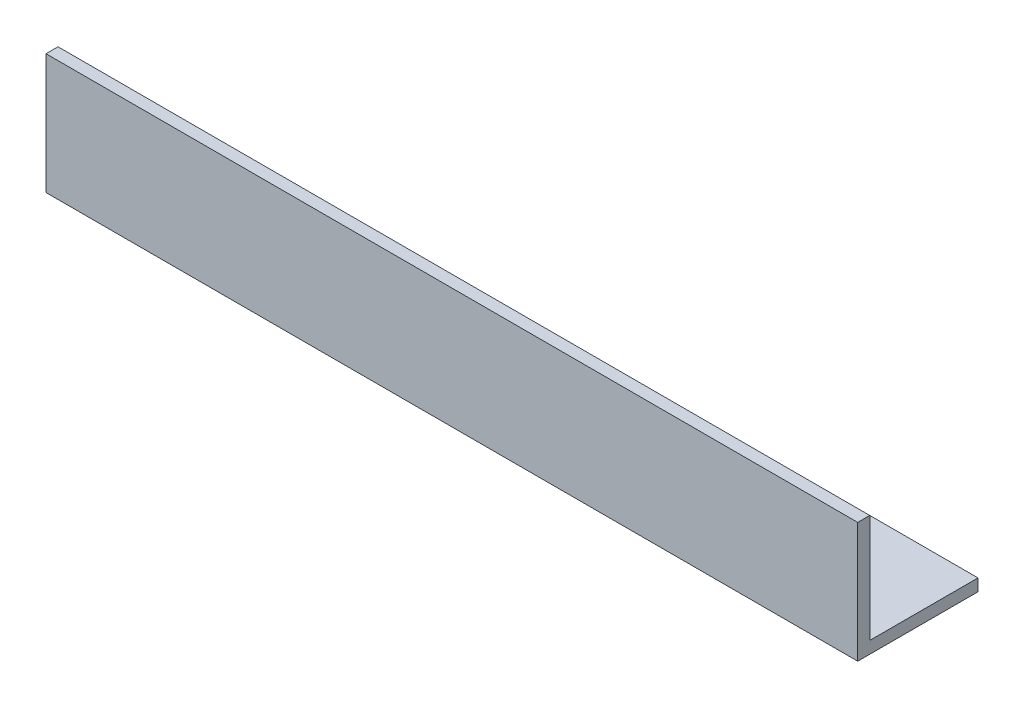
ISO-10303-21;
HEADER;
FILE_DESCRIPTION(('STEP AP214'),'2;1');
FILE_NAME('part.step','',(''),(''),'','','');
FILE_SCHEMA(('AUTOMOTIVE_DESIGN { 1 0 10303 214 1 1 1 1 }'));
ENDSEC;
DATA;
#1=APPLICATION_CONTEXT('core data for automotive mechanical design processes');
#2=APPLICATION_PROTOCOL_DEFINITION('international standard','automotive_design',2000,#1);
#3=PRODUCT_CONTEXT('',#1,'mechanical');
#4=PRODUCT('Part','Part','',(#3));
#5=PRODUCT_RELATED_PRODUCT_CATEGORY('part','',(#4));
#6=PRODUCT_DEFINITION_FORMATION('','',#4);
#7=PRODUCT_DEFINITION_CONTEXT('part definition',#1,'design');
#8=PRODUCT_DEFINITION('design','',#6,#7);
#9=PRODUCT_DEFINITION_SHAPE('','',#8);
#10=(LENGTH_UNIT() NAMED_UNIT(*) SI_UNIT(.MILLI.,.METRE.));
#11=(NAMED_UNIT(*) PLANE_ANGLE_UNIT() SI_UNIT($,.RADIAN.));
#12=(NAMED_UNIT(*) SI_UNIT($,.STERADIAN.) SOLID_ANGLE_UNIT());
#13=UNCERTAINTY_MEASURE_WITH_UNIT(LENGTH_MEASURE(1.E-05),#10,'distance_accuracy_value','');
#14=(GEOMETRIC_REPRESENTATION_CONTEXT(3) GLOBAL_UNCERTAINTY_ASSIGNED_CONTEXT((#13)) GLOBAL_UNIT_ASSIGNED_CONTEXT((#10,
#11,#12)) REPRESENTATION_CONTEXT('',''));
#15=CARTESIAN_POINT('',(0.,0.,0.));
#16=DIRECTION('',(0.,0.,1.));
#17=DIRECTION('',(1.,0.,0.));
#18=AXIS2_PLACEMENT_3D('',#15,#16,#17);
#19=CARTESIAN_POINT('',(135.,20.,-2.));
#20=DIRECTION('',(0.,-1.,0.));
#21=DIRECTION('',(0.,0.,-1.));
#22=AXIS2_PLACEMENT_3D('',#19,#20,#21);
#23=PLANE('',#22);
#24=DIRECTION('',(0.,0.,1.));
#25=VECTOR('',#24,1.);
#26=CARTESIAN_POINT('',(0.,20.,-2.));
#27=LINE('',#26,#25);
#28=CARTESIAN_POINT('',(0.,20.,-2.));
#29=VERTEX_POINT('',#28);
#30=CARTESIAN_POINT('',(0.,20.,0.));
#31=VERTEX_POINT('',#30);
#32=EDGE_CURVE('E127',#29,#31,#27,.T.);
#33=ORIENTED_EDGE('',*,*,#32,.T.);
#34=DIRECTION('',(-1.,0.,0.));
#35=VECTOR('',#34,1.);
#36=CARTESIAN_POINT('',(135.,20.,0.));
#37=LINE('',#36,#35);
#38=CARTESIAN_POINT('',(135.,20.,0.));
#39=VERTEX_POINT('',#38);
#40=EDGE_CURVE('E11',#39,#31,#37,.T.);
#41=ORIENTED_EDGE('',*,*,#40,.F.);
#42=DIRECTION('',(0.,0.,1.));
#43=VECTOR('',#42,1.);
#44=CARTESIAN_POINT('',(135.,20.,-2.));
#45=LINE('',#44,#43);
#46=CARTESIAN_POINT('',(135.,20.,-2.));
#47=VERTEX_POINT('',#46);
#48=EDGE_CURVE('E138',#47,#39,#45,.T.);
#49=ORIENTED_EDGE('',*,*,#48,.F.);
#50=DIRECTION('',(-1.,0.,0.));
#51=VECTOR('',#50,1.);
#52=CARTESIAN_POINT('',(135.,20.,-2.));
#53=LINE('',#52,#51);
#54=EDGE_CURVE('E123',#47,#29,#53,.T.);
#55=ORIENTED_EDGE('',*,*,#54,.T.);
#56=EDGE_LOOP('',(#33,#41,#49,#55));
#57=FACE_BOUND('',#56,.T.);
#58=ADVANCED_FACE('F43',(#57),#23,.F.);
#59=CARTESIAN_POINT('',(135.,20.,0.));
#60=DIRECTION('',(0.,0.,-1.));
#61=DIRECTION('',(0.,1.,0.));
#62=AXIS2_PLACEMENT_3D('',#59,#60,#61);
#63=PLANE('',#62);
#64=DIRECTION('',(0.,-1.,0.));
#65=VECTOR('',#64,1.);
#66=CARTESIAN_POINT('',(0.,20.,0.));
#67=LINE('',#66,#65);
#68=CARTESIAN_POINT('',(0.,0.,0.));
#69=VERTEX_POINT('',#68);
#70=EDGE_CURVE('E130',#31,#69,#67,.T.);
#71=ORIENTED_EDGE('',*,*,#70,.T.);
#72=DIRECTION('',(-1.,0.,0.));
#73=VECTOR('',#72,1.);
#74=CARTESIAN_POINT('',(135.,0.,0.));
#75=LINE('',#74,#73);
#76=CARTESIAN_POINT('',(135.,0.,0.));
#77=VERTEX_POINT('',#76);
#78=EDGE_CURVE('E51',#77,#69,#75,.T.);
#79=ORIENTED_EDGE('',*,*,#78,.F.);
#80=DIRECTION('',(0.,-1.,0.));
#81=VECTOR('',#80,1.);
#82=CARTESIAN_POINT('',(135.,20.,0.));
#83=LINE('',#82,#81);
#84=EDGE_CURVE('E96',#39,#77,#83,.T.);
#85=ORIENTED_EDGE('',*,*,#84,.F.);
#86=ORIENTED_EDGE('',*,*,#40,.T.);
#87=EDGE_LOOP('',(#71,#79,#85,#86));
#88=FACE_BOUND('',#87,.T.);
#89=ADVANCED_FACE('F164',(#88),#63,.F.);
#90=CARTESIAN_POINT('',(135.,0.,0.));
#91=DIRECTION('',(0.,1.,0.));
#92=DIRECTION('',(0.,0.,1.));
#93=AXIS2_PLACEMENT_3D('',#90,#91,#92);
#94=PLANE('',#93);
#95=CARTESIAN_POINT('',(8.,0.,-11.));
#96=DIRECTION('',(0.,1.,0.));
#97=DIRECTION('',(0.,0.,1.));
#98=AXIS2_PLACEMENT_3D('',#95,#96,#97);
#99=CIRCLE('',#98,2.5);
#100=CARTESIAN_POINT('',(8.,0.,-8.5));
#101=VERTEX_POINT('',#100);
#102=EDGE_CURVE('E131',#101,#101,#99,.T.);
#103=ORIENTED_EDGE('',*,*,#102,.T.);
#104=EDGE_LOOP('',(#103));
#105=FACE_BOUND('',#104,.T.);
#106=CARTESIAN_POINT('',(30.,0.,-11.));
#107=DIRECTION('',(0.,1.,0.));
#108=DIRECTION('',(0.,0.,1.));
#109=AXIS2_PLACEMENT_3D('',#106,#107,#108);
#110=CIRCLE('',#109,2.5);
#111=CARTESIAN_POINT('',(30.,0.,-8.5));
#112=VERTEX_POINT('',#111);
#113=EDGE_CURVE('E237',#112,#112,#110,.T.);
#114=ORIENTED_EDGE('',*,*,#113,.T.);
#115=EDGE_LOOP('',(#114));
#116=FACE_BOUND('',#115,.T.);
#117=DIRECTION('',(0.,0.,-1.));
#118=VECTOR('',#117,1.);
#119=CARTESIAN_POINT('',(0.,0.,0.));
#120=LINE('',#119,#118);
#121=CARTESIAN_POINT('',(0.,0.,-20.));
#122=VERTEX_POINT('',#121);
#123=EDGE_CURVE('E133',#69,#122,#120,.T.);
#124=ORIENTED_EDGE('',*,*,#123,.T.);
#125=DIRECTION('',(-1.,0.,0.));
#126=VECTOR('',#125,1.);
#127=CARTESIAN_POINT('',(135.,0.,-20.));
#128=LINE('',#127,#126);
#129=CARTESIAN_POINT('',(135.,0.,-20.));
#130=VERTEX_POINT('',#129);
#131=EDGE_CURVE('E118',#130,#122,#128,.T.);
#132=ORIENTED_EDGE('',*,*,#131,.F.);
#133=DIRECTION('',(0.,0.,-1.));
#134=VECTOR('',#133,1.);
#135=CARTESIAN_POINT('',(135.,0.,0.));
#136=LINE('',#135,#134);
#137=EDGE_CURVE('E109',#77,#130,#136,.T.);
#138=ORIENTED_EDGE('',*,*,#137,.F.);
#139=ORIENTED_EDGE('',*,*,#78,.T.);
#140=EDGE_LOOP('',(#124,#132,#138,#139));
#141=FACE_BOUND('',#140,.T.);
#142=ADVANCED_FACE('F144',(#105,#116,#141),#94,.F.);
#143=CARTESIAN_POINT('',(135.,0.,-20.));
#144=DIRECTION('',(0.,0.,1.));
#145=DIRECTION('',(1.,0.,0.));
#146=AXIS2_PLACEMENT_3D('',#143,#144,#145);
#147=PLANE('',#146);
#148=DIRECTION('',(0.,1.,0.));
#149=VECTOR('',#148,1.);
#150=CARTESIAN_POINT('',(0.,0.,-20.));
#151=LINE('',#150,#149);
#152=CARTESIAN_POINT('',(0.,2.,-20.));
#153=VERTEX_POINT('',#152);
#154=EDGE_CURVE('E117',#122,#153,#151,.T.);
#155=ORIENTED_EDGE('',*,*,#154,.T.);
#156=DIRECTION('',(-1.,0.,0.));
#157=VECTOR('',#156,1.);
#158=CARTESIAN_POINT('',(135.,2.,-20.));
#159=LINE('',#158,#157);
#160=CARTESIAN_POINT('',(135.,2.,-20.));
#161=VERTEX_POINT('',#160);
#162=EDGE_CURVE('E114',#161,#153,#159,.T.);
#163=ORIENTED_EDGE('',*,*,#162,.F.);
#164=DIRECTION('',(0.,1.,0.));
#165=VECTOR('',#164,1.);
#166=CARTESIAN_POINT('',(135.,0.,-20.));
#167=LINE('',#166,#165);
#168=EDGE_CURVE('E103',#130,#161,#167,.T.);
#169=ORIENTED_EDGE('',*,*,#168,.F.);
#170=ORIENTED_EDGE('',*,*,#131,.T.);
#171=EDGE_LOOP('',(#155,#163,#169,#170));
#172=FACE_BOUND('',#171,.T.);
#173=ADVANCED_FACE('F115',(#172),#147,.F.);
#174=CARTESIAN_POINT('',(135.,2.,-20.));
#175=DIRECTION('',(0.,-1.,0.));
#176=DIRECTION('',(0.,0.,-1.));
#177=AXIS2_PLACEMENT_3D('',#174,#175,#176);
#178=PLANE('',#177);
#179=CARTESIAN_POINT('',(8.,2.,-11.));
#180=DIRECTION('',(0.,1.,0.));
#181=DIRECTION('',(0.,0.,1.));
#182=AXIS2_PLACEMENT_3D('',#179,#180,#181);
#183=CIRCLE('',#182,2.5);
#184=CARTESIAN_POINT('',(8.,2.,-8.5));
#185=VERTEX_POINT('',#184);
#186=EDGE_CURVE('E232',#185,#185,#183,.T.);
#187=ORIENTED_EDGE('',*,*,#186,.F.);
#188=EDGE_LOOP('',(#187));
#189=FACE_BOUND('',#188,.T.);
#190=CARTESIAN_POINT('',(30.,2.,-11.));
#191=DIRECTION('',(0.,1.,0.));
#192=DIRECTION('',(0.,0.,1.));
#193=AXIS2_PLACEMENT_3D('',#190,#191,#192);
#194=CIRCLE('',#193,2.5);
#195=CARTESIAN_POINT('',(30.,2.,-8.5));
#196=VERTEX_POINT('',#195);
#197=EDGE_CURVE('E233',#196,#196,#194,.T.);
#198=ORIENTED_EDGE('',*,*,#197,.F.);
#199=EDGE_LOOP('',(#198));
#200=FACE_BOUND('',#199,.T.);
#201=DIRECTION('',(0.,0.,1.));
#202=VECTOR('',#201,1.);
#203=CARTESIAN_POINT('',(0.,2.,-20.));
#204=LINE('',#203,#202);
#205=CARTESIAN_POINT('',(0.,2.,-2.));
#206=VERTEX_POINT('',#205);
#207=EDGE_CURVE('E82',#153,#206,#204,.T.);
#208=ORIENTED_EDGE('',*,*,#207,.T.);
#209=DIRECTION('',(-1.,0.,0.));
#210=VECTOR('',#209,1.);
#211=CARTESIAN_POINT('',(135.,2.,-2.));
#212=LINE('',#211,#210);
#213=CARTESIAN_POINT('',(135.,2.,-2.));
#214=VERTEX_POINT('',#213);
#215=EDGE_CURVE('E119',#214,#206,#212,.T.);
#216=ORIENTED_EDGE('',*,*,#215,.F.);
#217=DIRECTION('',(0.,0.,1.));
#218=VECTOR('',#217,1.);
#219=CARTESIAN_POINT('',(135.,2.,-20.));
#220=LINE('',#219,#218);
#221=EDGE_CURVE('E107',#161,#214,#220,.T.);
#222=ORIENTED_EDGE('',*,*,#221,.F.);
#223=ORIENTED_EDGE('',*,*,#162,.T.);
#224=EDGE_LOOP('',(#208,#216,#222,#223));
#225=FACE_BOUND('',#224,.T.);
#226=ADVANCED_FACE('F121',(#189,#200,#225),#178,.F.);
#227=CARTESIAN_POINT('',(135.,2.,-2.));
#228=DIRECTION('',(0.,0.,1.));
#229=DIRECTION('',(0.,-1.,0.));
#230=AXIS2_PLACEMENT_3D('',#227,#228,#229);
#231=PLANE('',#230);
#232=DIRECTION('',(0.,1.,0.));
#233=VECTOR('',#232,1.);
#234=CARTESIAN_POINT('',(0.,2.,-2.));
#235=LINE('',#234,#233);
#236=EDGE_CURVE('E88',#206,#29,#235,.T.);
#237=ORIENTED_EDGE('',*,*,#236,.T.);
#238=ORIENTED_EDGE('',*,*,#54,.F.);
#239=DIRECTION('',(0.,1.,0.));
#240=VECTOR('',#239,1.);
#241=CARTESIAN_POINT('',(135.,2.,-2.));
#242=LINE('',#241,#240);
#243=EDGE_CURVE('E59',#214,#47,#242,.T.);
#244=ORIENTED_EDGE('',*,*,#243,.F.);
#245=ORIENTED_EDGE('',*,*,#215,.T.);
#246=EDGE_LOOP('',(#237,#238,#244,#245));
#247=FACE_BOUND('',#246,.T.);
#248=ADVANCED_FACE('F151',(#247),#231,.F.);
#249=CARTESIAN_POINT('',(135.,0.,0.));
#250=DIRECTION('',(1.,0.,0.));
#251=DIRECTION('',(0.,0.,-1.));
#252=AXIS2_PLACEMENT_3D('',#249,#250,#251);
#253=PLANE('',#252);
#254=ORIENTED_EDGE('',*,*,#48,.T.);
#255=ORIENTED_EDGE('',*,*,#84,.T.);
#256=ORIENTED_EDGE('',*,*,#137,.T.);
#257=ORIENTED_EDGE('',*,*,#168,.T.);
#258=ORIENTED_EDGE('',*,*,#221,.T.);
#259=ORIENTED_EDGE('',*,*,#243,.T.);
#260=EDGE_LOOP('',(#254,#255,#256,#257,#258,#259));
#261=FACE_BOUND('',#260,.T.);
#262=ADVANCED_FACE('F105',(#261),#253,.T.);
#263=CARTESIAN_POINT('',(0.,0.,0.));
#264=DIRECTION('',(1.,0.,0.));
#265=DIRECTION('',(0.,0.,-1.));
#266=AXIS2_PLACEMENT_3D('',#263,#264,#265);
#267=PLANE('',#266);
#268=ORIENTED_EDGE('',*,*,#32,.F.);
#269=ORIENTED_EDGE('',*,*,#236,.F.);
#270=ORIENTED_EDGE('',*,*,#207,.F.);
#271=ORIENTED_EDGE('',*,*,#154,.F.);
#272=ORIENTED_EDGE('',*,*,#123,.F.);
#273=ORIENTED_EDGE('',*,*,#70,.F.);
#274=EDGE_LOOP('',(#268,#269,#270,#271,#272,#273));
#275=FACE_BOUND('',#274,.T.);
#276=ADVANCED_FACE('F147',(#275),#267,.F.);
#277=CARTESIAN_POINT('',(30.,0.,-11.));
#278=DIRECTION('',(0.,1.,0.));
#279=DIRECTION('',(0.,0.,1.));
#280=AXIS2_PLACEMENT_3D('',#277,#278,#279);
#281=CYLINDRICAL_SURFACE('',#280,2.5);
#282=ORIENTED_EDGE('',*,*,#113,.F.);
#283=EDGE_LOOP('',(#282));
#284=FACE_BOUND('',#283,.T.);
#285=ORIENTED_EDGE('',*,*,#197,.T.);
#286=EDGE_LOOP('',(#285));
#287=FACE_BOUND('',#286,.T.);
#288=ADVANCED_FACE('F207',(#284,#287),#281,.F.);
#289=CARTESIAN_POINT('',(8.,0.,-11.));
#290=DIRECTION('',(0.,1.,0.));
#291=DIRECTION('',(0.,0.,1.));
#292=AXIS2_PLACEMENT_3D('',#289,#290,#291);
#293=CYLINDRICAL_SURFACE('',#292,2.5);
#294=ORIENTED_EDGE('',*,*,#102,.F.);
#295=EDGE_LOOP('',(#294));
#296=FACE_BOUND('',#295,.T.);
#297=ORIENTED_EDGE('',*,*,#186,.T.);
#298=EDGE_LOOP('',(#297));
#299=FACE_BOUND('',#298,.T.);
#300=ADVANCED_FACE('F214',(#296,#299),#293,.F.);
#301=CLOSED_SHELL('',(#58,#89,#142,#173,#226,#248,#262,#276,#288,#300));
#302=MANIFOLD_SOLID_BREP('B2',#301);
#303=ADVANCED_BREP_SHAPE_REPRESENTATION('',(#18,#302),#14);
#304=SHAPE_DEFINITION_REPRESENTATION(#9,#303);
ENDSEC;
END-ISO-10303-21;
